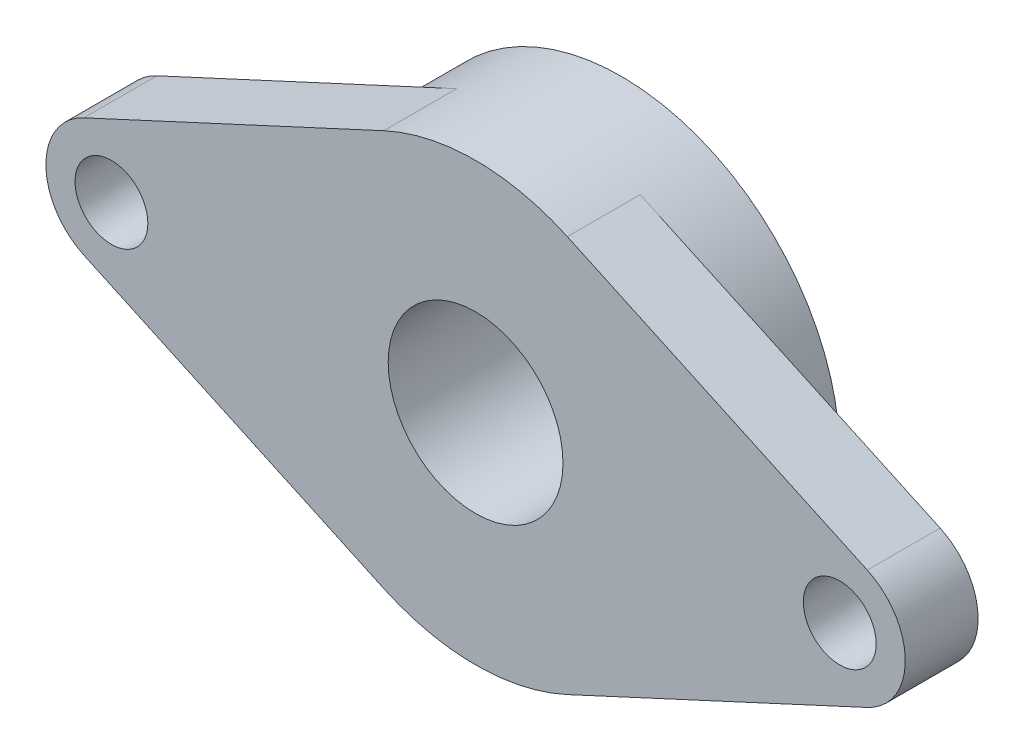
ISO-10303-21;
HEADER;
FILE_DESCRIPTION(('STEP AP214'),'2;1');
FILE_NAME('part.step','',(''),(''),'','','');
FILE_SCHEMA(('AUTOMOTIVE_DESIGN { 1 0 10303 214 1 1 1 1 }'));
ENDSEC;
DATA;
#1=APPLICATION_CONTEXT('core data for automotive mechanical design processes');
#2=APPLICATION_PROTOCOL_DEFINITION('international standard','automotive_design',2000,#1);
#3=PRODUCT_CONTEXT('',#1,'mechanical');
#4=PRODUCT('Part','Part','',(#3));
#5=PRODUCT_RELATED_PRODUCT_CATEGORY('part','',(#4));
#6=PRODUCT_DEFINITION_FORMATION('','',#4);
#7=PRODUCT_DEFINITION_CONTEXT('part definition',#1,'design');
#8=PRODUCT_DEFINITION('design','',#6,#7);
#9=PRODUCT_DEFINITION_SHAPE('','',#8);
#10=(LENGTH_UNIT() NAMED_UNIT(*) SI_UNIT(.MILLI.,.METRE.));
#11=(NAMED_UNIT(*) PLANE_ANGLE_UNIT() SI_UNIT($,.RADIAN.));
#12=(NAMED_UNIT(*) SI_UNIT($,.STERADIAN.) SOLID_ANGLE_UNIT());
#13=UNCERTAINTY_MEASURE_WITH_UNIT(LENGTH_MEASURE(1.E-05),#10,'distance_accuracy_value','');
#14=(GEOMETRIC_REPRESENTATION_CONTEXT(3) GLOBAL_UNCERTAINTY_ASSIGNED_CONTEXT((#13)) GLOBAL_UNIT_ASSIGNED_CONTEXT((#10,
#11,#12)) REPRESENTATION_CONTEXT('',''));
#15=CARTESIAN_POINT('',(0.,0.,0.));
#16=DIRECTION('',(0.,0.,1.));
#17=DIRECTION('',(1.,0.,0.));
#18=AXIS2_PLACEMENT_3D('',#15,#16,#17);
#19=CARTESIAN_POINT('',(0.,0.,0.));
#20=DIRECTION('',(0.,0.,1.));
#21=DIRECTION('',(1.,0.,0.));
#22=AXIS2_PLACEMENT_3D('',#19,#20,#21);
#23=PLANE('',#22);
#24=CARTESIAN_POINT('',(0.,0.,0.));
#25=DIRECTION('',(0.,0.,-1.));
#26=DIRECTION('',(-1.,0.,0.));
#27=AXIS2_PLACEMENT_3D('',#24,#25,#26);
#28=CIRCLE('',#27,15.);
#29=CARTESIAN_POINT('',(6.3,13.6128615654461,0.));
#30=VERTEX_POINT('',#29);
#31=CARTESIAN_POINT('',(6.3,-13.6128615654461,0.));
#32=VERTEX_POINT('',#31);
#33=EDGE_CURVE('E11',#30,#32,#28,.T.);
#34=ORIENTED_EDGE('',*,*,#33,.F.);
#35=DIRECTION('',(-0.907524104363074,0.42,0.));
#36=VECTOR('',#35,1.);
#37=CARTESIAN_POINT('',(6.3,13.6128615654461,0.));
#38=LINE('',#37,#36);
#39=CARTESIAN_POINT('',(26.89,4.08385846963383,0.));
#40=VERTEX_POINT('',#39);
#41=EDGE_CURVE('E154',#40,#30,#38,.T.);
#42=ORIENTED_EDGE('',*,*,#41,.F.);
#43=CARTESIAN_POINT('',(25.,0.,0.));
#44=DIRECTION('',(0.,0.,1.));
#45=DIRECTION('',(1.,0.,0.));
#46=AXIS2_PLACEMENT_3D('',#43,#44,#45);
#47=CIRCLE('',#46,4.5);
#48=CARTESIAN_POINT('',(26.89,-4.08385846963383,0.));
#49=VERTEX_POINT('',#48);
#50=EDGE_CURVE('E113',#40,#49,#47,.F.);
#51=ORIENTED_EDGE('',*,*,#50,.T.);
#52=DIRECTION('',(-0.907524104363074,-0.42,0.));
#53=VECTOR('',#52,1.);
#54=CARTESIAN_POINT('',(6.29999999999999,-13.6128615654461,0.));
#55=LINE('',#54,#53);
#56=EDGE_CURVE('E151',#49,#32,#55,.T.);
#57=ORIENTED_EDGE('',*,*,#56,.T.);
#58=EDGE_LOOP('',(#34,#42,#51,#57));
#59=FACE_BOUND('',#58,.T.);
#60=CARTESIAN_POINT('',(25.,0.,0.));
#61=DIRECTION('',(0.,0.,1.));
#62=DIRECTION('',(1.,0.,0.));
#63=AXIS2_PLACEMENT_3D('',#60,#61,#62);
#64=CIRCLE('',#63,2.5);
#65=CARTESIAN_POINT('',(27.5,0.,0.));
#66=VERTEX_POINT('',#65);
#67=EDGE_CURVE('E159',#66,#66,#64,.F.);
#68=ORIENTED_EDGE('',*,*,#67,.F.);
#69=EDGE_LOOP('',(#68));
#70=FACE_BOUND('',#69,.T.);
#71=ADVANCED_FACE('F35',(#59,#70),#23,.F.);
#72=CARTESIAN_POINT('',(-6.3,13.6128615654461,5.));
#73=DIRECTION('',(-0.42,0.907524104363074,0.));
#74=DIRECTION('',(-0.907524104363074,-0.42,0.));
#75=AXIS2_PLACEMENT_3D('',#72,#73,#74);
#76=PLANE('',#75);
#77=DIRECTION('',(0.907524104363074,0.42,0.));
#78=VECTOR('',#77,1.);
#79=CARTESIAN_POINT('',(-6.3,13.6128615654461,0.));
#80=LINE('',#79,#78);
#81=CARTESIAN_POINT('',(-26.89,4.08385846963383,0.));
#82=VERTEX_POINT('',#81);
#83=CARTESIAN_POINT('',(-6.3,13.6128615654461,0.));
#84=VERTEX_POINT('',#83);
#85=EDGE_CURVE('E142',#82,#84,#80,.T.);
#86=ORIENTED_EDGE('',*,*,#85,.F.);
#87=DIRECTION('',(0.,0.,-1.));
#88=VECTOR('',#87,1.);
#89=CARTESIAN_POINT('',(-26.89,4.08385846963383,5.));
#90=LINE('',#89,#88);
#91=CARTESIAN_POINT('',(-26.89,4.08385846963383,5.));
#92=VERTEX_POINT('',#91);
#93=EDGE_CURVE('E39',#92,#82,#90,.T.);
#94=ORIENTED_EDGE('',*,*,#93,.F.);
#95=DIRECTION('',(0.907524104363074,0.42,0.));
#96=VECTOR('',#95,1.);
#97=CARTESIAN_POINT('',(-6.3,13.6128615654461,5.));
#98=LINE('',#97,#96);
#99=CARTESIAN_POINT('',(-6.3,13.6128615654461,5.));
#100=VERTEX_POINT('',#99);
#101=EDGE_CURVE('E162',#92,#100,#98,.T.);
#102=ORIENTED_EDGE('',*,*,#101,.T.);
#103=DIRECTION('',(0.,0.,-1.));
#104=VECTOR('',#103,1.);
#105=CARTESIAN_POINT('',(-6.3,13.6128615654461,5.));
#106=LINE('',#105,#104);
#107=EDGE_CURVE('E141',#100,#84,#106,.T.);
#108=ORIENTED_EDGE('',*,*,#107,.T.);
#109=EDGE_LOOP('',(#86,#94,#102,#108));
#110=FACE_BOUND('',#109,.T.);
#111=ADVANCED_FACE('F37',(#110),#76,.T.);
#112=CARTESIAN_POINT('',(-25.,0.,5.));
#113=DIRECTION('',(0.,0.,-1.));
#114=DIRECTION('',(-1.,0.,0.));
#115=AXIS2_PLACEMENT_3D('',#112,#113,#114);
#116=CYLINDRICAL_SURFACE('',#115,4.5);
#117=CARTESIAN_POINT('',(-25.,0.,0.));
#118=DIRECTION('',(0.,0.,1.));
#119=DIRECTION('',(1.,0.,0.));
#120=AXIS2_PLACEMENT_3D('',#117,#118,#119);
#121=CIRCLE('',#120,4.5);
#122=CARTESIAN_POINT('',(-26.89,-4.08385846963383,0.));
#123=VERTEX_POINT('',#122);
#124=EDGE_CURVE('E145',#82,#123,#121,.T.);
#125=ORIENTED_EDGE('',*,*,#124,.T.);
#126=DIRECTION('',(0.,0.,-1.));
#127=VECTOR('',#126,1.);
#128=CARTESIAN_POINT('',(-26.89,-4.08385846963383,5.));
#129=LINE('',#128,#127);
#130=CARTESIAN_POINT('',(-26.89,-4.08385846963383,5.));
#131=VERTEX_POINT('',#130);
#132=EDGE_CURVE('E171',#131,#123,#129,.T.);
#133=ORIENTED_EDGE('',*,*,#132,.F.);
#134=CARTESIAN_POINT('',(-25.,0.,5.));
#135=DIRECTION('',(0.,0.,1.));
#136=DIRECTION('',(1.,0.,0.));
#137=AXIS2_PLACEMENT_3D('',#134,#135,#136);
#138=CIRCLE('',#137,4.5);
#139=EDGE_CURVE('E185',#92,#131,#138,.T.);
#140=ORIENTED_EDGE('',*,*,#139,.F.);
#141=ORIENTED_EDGE('',*,*,#93,.T.);
#142=EDGE_LOOP('',(#125,#133,#140,#141));
#143=FACE_BOUND('',#142,.T.);
#144=ADVANCED_FACE('F197',(#143),#116,.T.);
#145=CARTESIAN_POINT('',(-6.29999999999999,-13.6128615654461,5.));
#146=DIRECTION('',(0.42,0.907524104363074,0.));
#147=DIRECTION('',(-0.907524104363074,0.42,0.));
#148=AXIS2_PLACEMENT_3D('',#145,#146,#147);
#149=PLANE('',#148);
#150=DIRECTION('',(0.907524104363074,-0.42,0.));
#151=VECTOR('',#150,1.);
#152=CARTESIAN_POINT('',(-6.29999999999999,-13.6128615654461,0.));
#153=LINE('',#152,#151);
#154=CARTESIAN_POINT('',(-6.3,-13.6128615654461,0.));
#155=VERTEX_POINT('',#154);
#156=EDGE_CURVE('E148',#123,#155,#153,.T.);
#157=ORIENTED_EDGE('',*,*,#156,.T.);
#158=DIRECTION('',(0.,0.,-1.));
#159=VECTOR('',#158,1.);
#160=CARTESIAN_POINT('',(-6.3,-13.6128615654461,5.));
#161=LINE('',#160,#159);
#162=CARTESIAN_POINT('',(-6.3,-13.6128615654461,5.));
#163=VERTEX_POINT('',#162);
#164=EDGE_CURVE('E169',#163,#155,#161,.T.);
#165=ORIENTED_EDGE('',*,*,#164,.F.);
#166=DIRECTION('',(0.907524104363074,-0.42,0.));
#167=VECTOR('',#166,1.);
#168=CARTESIAN_POINT('',(-6.29999999999999,-13.6128615654461,5.));
#169=LINE('',#168,#167);
#170=EDGE_CURVE('E187',#131,#163,#169,.T.);
#171=ORIENTED_EDGE('',*,*,#170,.F.);
#172=ORIENTED_EDGE('',*,*,#132,.T.);
#173=EDGE_LOOP('',(#157,#165,#171,#172));
#174=FACE_BOUND('',#173,.T.);
#175=ADVANCED_FACE('F198',(#174),#149,.F.);
#176=CARTESIAN_POINT('',(6.29999999999999,-13.6128615654461,5.));
#177=DIRECTION('',(0.42,-0.907524104363074,0.));
#178=DIRECTION('',(0.907524104363074,0.42,0.));
#179=AXIS2_PLACEMENT_3D('',#176,#177,#178);
#180=PLANE('',#179);
#181=ORIENTED_EDGE('',*,*,#56,.F.);
#182=DIRECTION('',(0.,0.,-1.));
#183=VECTOR('',#182,1.);
#184=CARTESIAN_POINT('',(26.89,-4.08385846963383,5.));
#185=LINE('',#184,#183);
#186=CARTESIAN_POINT('',(26.89,-4.08385846963383,5.));
#187=VERTEX_POINT('',#186);
#188=EDGE_CURVE('E114',#187,#49,#185,.T.);
#189=ORIENTED_EDGE('',*,*,#188,.F.);
#190=DIRECTION('',(-0.907524104363074,-0.42,0.));
#191=VECTOR('',#190,1.);
#192=CARTESIAN_POINT('',(6.29999999999999,-13.6128615654461,5.));
#193=LINE('',#192,#191);
#194=CARTESIAN_POINT('',(6.3,-13.6128615654461,5.));
#195=VERTEX_POINT('',#194);
#196=EDGE_CURVE('E126',#187,#195,#193,.T.);
#197=ORIENTED_EDGE('',*,*,#196,.T.);
#198=DIRECTION('',(0.,0.,-1.));
#199=VECTOR('',#198,1.);
#200=CARTESIAN_POINT('',(6.3,-13.6128615654461,5.));
#201=LINE('',#200,#199);
#202=EDGE_CURVE('E167',#195,#32,#201,.T.);
#203=ORIENTED_EDGE('',*,*,#202,.T.);
#204=EDGE_LOOP('',(#181,#189,#197,#203));
#205=FACE_BOUND('',#204,.T.);
#206=ADVANCED_FACE('F195',(#205),#180,.T.);
#207=CARTESIAN_POINT('',(25.,0.,5.));
#208=DIRECTION('',(0.,0.,-1.));
#209=DIRECTION('',(-1.,0.,0.));
#210=AXIS2_PLACEMENT_3D('',#207,#208,#209);
#211=CYLINDRICAL_SURFACE('',#210,4.5);
#212=ORIENTED_EDGE('',*,*,#50,.F.);
#213=DIRECTION('',(0.,0.,-1.));
#214=VECTOR('',#213,1.);
#215=CARTESIAN_POINT('',(26.89,4.08385846963383,5.));
#216=LINE('',#215,#214);
#217=CARTESIAN_POINT('',(26.89,4.08385846963383,5.));
#218=VERTEX_POINT('',#217);
#219=EDGE_CURVE('E81',#218,#40,#216,.T.);
#220=ORIENTED_EDGE('',*,*,#219,.F.);
#221=CARTESIAN_POINT('',(25.,0.,5.));
#222=DIRECTION('',(0.,0.,1.));
#223=DIRECTION('',(1.,0.,0.));
#224=AXIS2_PLACEMENT_3D('',#221,#222,#223);
#225=CIRCLE('',#224,4.5);
#226=EDGE_CURVE('E111',#218,#187,#225,.F.);
#227=ORIENTED_EDGE('',*,*,#226,.T.);
#228=ORIENTED_EDGE('',*,*,#188,.T.);
#229=EDGE_LOOP('',(#212,#220,#227,#228));
#230=FACE_BOUND('',#229,.T.);
#231=ADVANCED_FACE('F109',(#230),#211,.T.);
#232=CARTESIAN_POINT('',(6.3,13.6128615654461,5.));
#233=DIRECTION('',(-0.42,-0.907524104363074,0.));
#234=DIRECTION('',(0.907524104363074,-0.42,0.));
#235=AXIS2_PLACEMENT_3D('',#232,#233,#234);
#236=PLANE('',#235);
#237=ORIENTED_EDGE('',*,*,#41,.T.);
#238=DIRECTION('',(0.,0.,-1.));
#239=VECTOR('',#238,1.);
#240=CARTESIAN_POINT('',(6.3,13.6128615654461,5.));
#241=LINE('',#240,#239);
#242=CARTESIAN_POINT('',(6.3,13.6128615654461,5.));
#243=VERTEX_POINT('',#242);
#244=EDGE_CURVE('E115',#243,#30,#241,.T.);
#245=ORIENTED_EDGE('',*,*,#244,.F.);
#246=DIRECTION('',(-0.907524104363074,0.42,0.));
#247=VECTOR('',#246,1.);
#248=CARTESIAN_POINT('',(6.3,13.6128615654461,5.));
#249=LINE('',#248,#247);
#250=EDGE_CURVE('E118',#218,#243,#249,.T.);
#251=ORIENTED_EDGE('',*,*,#250,.F.);
#252=ORIENTED_EDGE('',*,*,#219,.T.);
#253=EDGE_LOOP('',(#237,#245,#251,#252));
#254=FACE_BOUND('',#253,.T.);
#255=ADVANCED_FACE('F119',(#254),#236,.F.);
#256=CARTESIAN_POINT('',(-25.,0.,5.));
#257=DIRECTION('',(0.,0.,-1.));
#258=DIRECTION('',(-1.,0.,0.));
#259=AXIS2_PLACEMENT_3D('',#256,#257,#258);
#260=CYLINDRICAL_SURFACE('',#259,2.5);
#261=CARTESIAN_POINT('',(-25.,0.,5.));
#262=DIRECTION('',(0.,0.,1.));
#263=DIRECTION('',(1.,0.,0.));
#264=AXIS2_PLACEMENT_3D('',#261,#262,#263);
#265=CIRCLE('',#264,2.5);
#266=CARTESIAN_POINT('',(-22.5,0.,5.));
#267=VERTEX_POINT('',#266);
#268=EDGE_CURVE('E135',#267,#267,#265,.T.);
#269=ORIENTED_EDGE('',*,*,#268,.T.);
#270=EDGE_LOOP('',(#269));
#271=FACE_BOUND('',#270,.T.);
#272=CARTESIAN_POINT('',(-25.,0.,0.));
#273=DIRECTION('',(0.,0.,1.));
#274=DIRECTION('',(1.,0.,0.));
#275=AXIS2_PLACEMENT_3D('',#272,#273,#274);
#276=CIRCLE('',#275,2.5);
#277=CARTESIAN_POINT('',(-22.5,0.,0.));
#278=VERTEX_POINT('',#277);
#279=EDGE_CURVE('E156',#278,#278,#276,.T.);
#280=ORIENTED_EDGE('',*,*,#279,.F.);
#281=EDGE_LOOP('',(#280));
#282=FACE_BOUND('',#281,.T.);
#283=ADVANCED_FACE('F207',(#271,#282),#260,.F.);
#284=CARTESIAN_POINT('',(0.,0.,5.));
#285=DIRECTION('',(0.,0.,-1.));
#286=DIRECTION('',(-1.,0.,0.));
#287=AXIS2_PLACEMENT_3D('',#284,#285,#286);
#288=CYLINDRICAL_SURFACE('',#287,6.);
#289=CARTESIAN_POINT('',(0.,0.,5.));
#290=DIRECTION('',(0.,0.,1.));
#291=DIRECTION('',(1.,0.,0.));
#292=AXIS2_PLACEMENT_3D('',#289,#290,#291);
#293=CIRCLE('',#292,6.);
#294=CARTESIAN_POINT('',(6.,0.,5.));
#295=VERTEX_POINT('',#294);
#296=EDGE_CURVE('E132',#295,#295,#293,.T.);
#297=ORIENTED_EDGE('',*,*,#296,.T.);
#298=EDGE_LOOP('',(#297));
#299=FACE_BOUND('',#298,.T.);
#300=CARTESIAN_POINT('',(0.,0.,-5.));
#301=DIRECTION('',(0.,0.,-1.));
#302=DIRECTION('',(-1.,0.,0.));
#303=AXIS2_PLACEMENT_3D('',#300,#301,#302);
#304=CIRCLE('',#303,6.);
#305=CARTESIAN_POINT('',(-6.,0.,-5.));
#306=VERTEX_POINT('',#305);
#307=EDGE_CURVE('E305',#306,#306,#304,.T.);
#308=ORIENTED_EDGE('',*,*,#307,.T.);
#309=EDGE_LOOP('',(#308));
#310=FACE_BOUND('',#309,.T.);
#311=ADVANCED_FACE('F209',(#299,#310),#288,.F.);
#312=CARTESIAN_POINT('',(0.,0.,5.));
#313=DIRECTION('',(0.,0.,-1.));
#314=DIRECTION('',(-1.,0.,0.));
#315=AXIS2_PLACEMENT_3D('',#312,#313,#314);
#316=CYLINDRICAL_SURFACE('',#315,15.);
#317=ORIENTED_EDGE('',*,*,#244,.T.);
#318=ORIENTED_EDGE('',*,*,#33,.T.);
#319=ORIENTED_EDGE('',*,*,#202,.F.);
#320=CARTESIAN_POINT('',(0.,0.,5.));
#321=DIRECTION('',(0.,0.,1.));
#322=DIRECTION('',(1.,0.,0.));
#323=AXIS2_PLACEMENT_3D('',#320,#321,#322);
#324=CIRCLE('',#323,15.);
#325=EDGE_CURVE('E128',#163,#195,#324,.T.);
#326=ORIENTED_EDGE('',*,*,#325,.F.);
#327=ORIENTED_EDGE('',*,*,#164,.T.);
#328=EDGE_CURVE('E45',#155,#84,#28,.T.);
#329=ORIENTED_EDGE('',*,*,#328,.T.);
#330=ORIENTED_EDGE('',*,*,#107,.F.);
#331=EDGE_CURVE('E54',#243,#100,#324,.T.);
#332=ORIENTED_EDGE('',*,*,#331,.F.);
#333=EDGE_LOOP('',(#317,#318,#319,#326,#327,#329,#330,#332));
#334=FACE_BOUND('',#333,.T.);
#335=CARTESIAN_POINT('',(0.,0.,-5.));
#336=DIRECTION('',(0.,0.,-1.));
#337=DIRECTION('',(-1.,0.,0.));
#338=AXIS2_PLACEMENT_3D('',#335,#336,#337);
#339=CIRCLE('',#338,15.);
#340=CARTESIAN_POINT('',(-15.,0.,-5.));
#341=VERTEX_POINT('',#340);
#342=EDGE_CURVE('E146',#341,#341,#339,.T.);
#343=ORIENTED_EDGE('',*,*,#342,.F.);
#344=EDGE_LOOP('',(#343));
#345=FACE_BOUND('',#344,.T.);
#346=ADVANCED_FACE('F191',(#334,#345),#316,.T.);
#347=CARTESIAN_POINT('',(25.,0.,5.));
#348=DIRECTION('',(0.,0.,-1.));
#349=DIRECTION('',(-1.,0.,0.));
#350=AXIS2_PLACEMENT_3D('',#347,#348,#349);
#351=CYLINDRICAL_SURFACE('',#350,2.5);
#352=CARTESIAN_POINT('',(25.,0.,5.));
#353=DIRECTION('',(0.,0.,1.));
#354=DIRECTION('',(1.,0.,0.));
#355=AXIS2_PLACEMENT_3D('',#352,#353,#354);
#356=CIRCLE('',#355,2.5);
#357=CARTESIAN_POINT('',(27.5,0.,5.));
#358=VERTEX_POINT('',#357);
#359=EDGE_CURVE('E138',#358,#358,#356,.F.);
#360=ORIENTED_EDGE('',*,*,#359,.F.);
#361=EDGE_LOOP('',(#360));
#362=FACE_BOUND('',#361,.T.);
#363=ORIENTED_EDGE('',*,*,#67,.T.);
#364=EDGE_LOOP('',(#363));
#365=FACE_BOUND('',#364,.T.);
#366=ADVANCED_FACE('F226',(#362,#365),#351,.F.);
#367=CARTESIAN_POINT('',(0.,0.,5.));
#368=DIRECTION('',(0.,0.,1.));
#369=DIRECTION('',(1.,0.,0.));
#370=AXIS2_PLACEMENT_3D('',#367,#368,#369);
#371=PLANE('',#370);
#372=ORIENTED_EDGE('',*,*,#101,.F.);
#373=ORIENTED_EDGE('',*,*,#139,.T.);
#374=ORIENTED_EDGE('',*,*,#170,.T.);
#375=ORIENTED_EDGE('',*,*,#325,.T.);
#376=ORIENTED_EDGE('',*,*,#196,.F.);
#377=ORIENTED_EDGE('',*,*,#226,.F.);
#378=ORIENTED_EDGE('',*,*,#250,.T.);
#379=ORIENTED_EDGE('',*,*,#331,.T.);
#380=EDGE_LOOP('',(#372,#373,#374,#375,#376,#377,#378,#379));
#381=FACE_BOUND('',#380,.T.);
#382=ORIENTED_EDGE('',*,*,#296,.F.);
#383=EDGE_LOOP('',(#382));
#384=FACE_BOUND('',#383,.T.);
#385=ORIENTED_EDGE('',*,*,#268,.F.);
#386=EDGE_LOOP('',(#385));
#387=FACE_BOUND('',#386,.T.);
#388=ORIENTED_EDGE('',*,*,#359,.T.);
#389=EDGE_LOOP('',(#388));
#390=FACE_BOUND('',#389,.T.);
#391=ADVANCED_FACE('F123',(#381,#384,#387,#390),#371,.T.);
#392=ORIENTED_EDGE('',*,*,#328,.F.);
#393=ORIENTED_EDGE('',*,*,#156,.F.);
#394=ORIENTED_EDGE('',*,*,#124,.F.);
#395=ORIENTED_EDGE('',*,*,#85,.T.);
#396=EDGE_LOOP('',(#392,#393,#394,#395));
#397=FACE_BOUND('',#396,.T.);
#398=ORIENTED_EDGE('',*,*,#279,.T.);
#399=EDGE_LOOP('',(#398));
#400=FACE_BOUND('',#399,.T.);
#401=ADVANCED_FACE('F200',(#397,#400),#23,.F.);
#402=CARTESIAN_POINT('',(0.,0.,-5.));
#403=DIRECTION('',(0.,0.,-1.));
#404=DIRECTION('',(-1.,0.,0.));
#405=AXIS2_PLACEMENT_3D('',#402,#403,#404);
#406=PLANE('',#405);
#407=ORIENTED_EDGE('',*,*,#342,.T.);
#408=EDGE_LOOP('',(#407));
#409=FACE_BOUND('',#408,.T.);
#410=ORIENTED_EDGE('',*,*,#307,.F.);
#411=EDGE_LOOP('',(#410));
#412=FACE_BOUND('',#411,.T.);
#413=ADVANCED_FACE('F203',(#409,#412),#406,.T.);
#414=CLOSED_SHELL('',(#71,#111,#144,#175,#206,#231,#255,#283,#311,#346,#366,#391,#401,#413));
#415=MANIFOLD_SOLID_BREP('B2',#414);
#416=ADVANCED_BREP_SHAPE_REPRESENTATION('',(#18,#415),#14);
#417=SHAPE_DEFINITION_REPRESENTATION(#9,#416);
ENDSEC;
END-ISO-10303-21;
